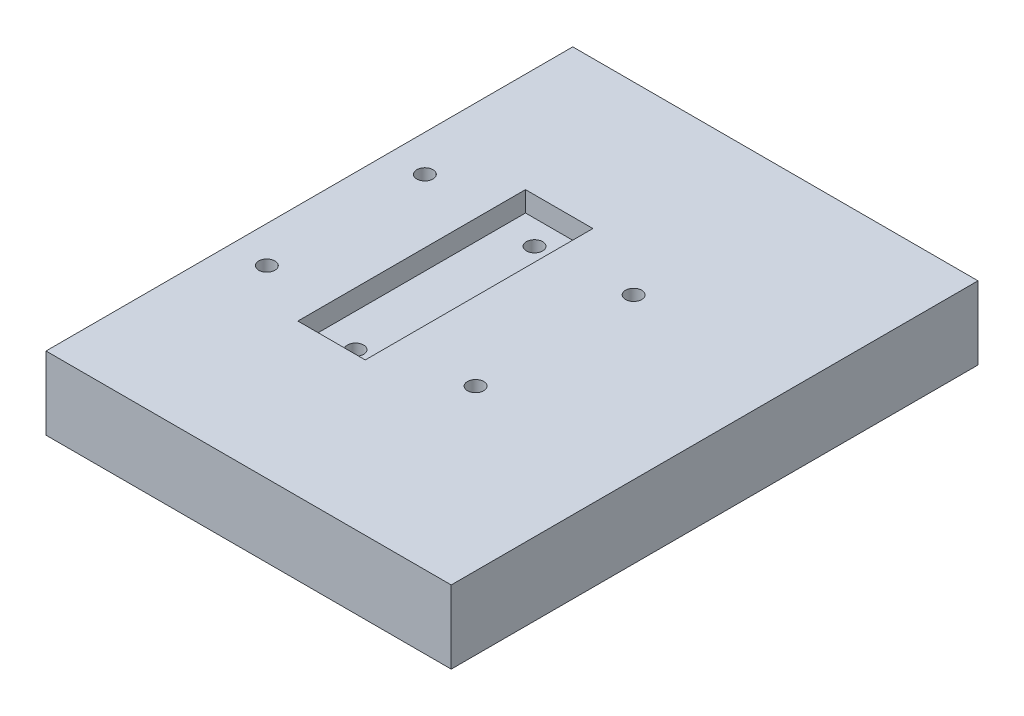
ISO-10303-21;
HEADER;
FILE_DESCRIPTION(('STEP AP214'),'2;1');
FILE_NAME('part.step','',(''),(''),'','','');
FILE_SCHEMA(('AUTOMOTIVE_DESIGN { 1 0 10303 214 1 1 1 1 }'));
ENDSEC;
DATA;
#1=APPLICATION_CONTEXT('core data for automotive mechanical design processes');
#2=APPLICATION_PROTOCOL_DEFINITION('international standard','automotive_design',2000,#1);
#3=PRODUCT_CONTEXT('',#1,'mechanical');
#4=PRODUCT('Part','Part','',(#3));
#5=PRODUCT_RELATED_PRODUCT_CATEGORY('part','',(#4));
#6=PRODUCT_DEFINITION_FORMATION('','',#4);
#7=PRODUCT_DEFINITION_CONTEXT('part definition',#1,'design');
#8=PRODUCT_DEFINITION('design','',#6,#7);
#9=PRODUCT_DEFINITION_SHAPE('','',#8);
#10=(LENGTH_UNIT() NAMED_UNIT(*) SI_UNIT(.MILLI.,.METRE.));
#11=(NAMED_UNIT(*) PLANE_ANGLE_UNIT() SI_UNIT($,.RADIAN.));
#12=(NAMED_UNIT(*) SI_UNIT($,.STERADIAN.) SOLID_ANGLE_UNIT());
#13=UNCERTAINTY_MEASURE_WITH_UNIT(LENGTH_MEASURE(1.E-05),#10,'distance_accuracy_value','');
#14=(GEOMETRIC_REPRESENTATION_CONTEXT(3) GLOBAL_UNCERTAINTY_ASSIGNED_CONTEXT((#13)) GLOBAL_UNIT_ASSIGNED_CONTEXT((#10,
#11,#12)) REPRESENTATION_CONTEXT('',''));
#15=CARTESIAN_POINT('',(0.,0.,0.));
#16=DIRECTION('',(0.,0.,1.));
#17=DIRECTION('',(1.,0.,0.));
#18=AXIS2_PLACEMENT_3D('',#15,#16,#17);
#19=CARTESIAN_POINT('',(-116.573423843831,0.,93.3786848568105));
#20=DIRECTION('',(0.,1.,0.));
#21=DIRECTION('',(0.,0.,1.));
#22=AXIS2_PLACEMENT_3D('',#19,#20,#21);
#23=CYLINDRICAL_SURFACE('',#22,1.99999999999774);
#24=CARTESIAN_POINT('',(-116.573423843831,0.,93.3786848568105));
#25=DIRECTION('',(0.,1.,0.));
#26=DIRECTION('',(0.,0.,1.));
#27=AXIS2_PLACEMENT_3D('',#24,#25,#26);
#28=CIRCLE('',#27,1.99999999999774);
#29=CARTESIAN_POINT('',(-116.573423843831,0.,95.3786848568083));
#30=VERTEX_POINT('',#29);
#31=EDGE_CURVE('E184',#30,#30,#28,.T.);
#32=ORIENTED_EDGE('',*,*,#31,.F.);
#33=EDGE_LOOP('',(#32));
#34=FACE_BOUND('',#33,.T.);
#35=CARTESIAN_POINT('',(-116.573423843831,13.,93.3786848568105));
#36=DIRECTION('',(0.,1.,0.));
#37=DIRECTION('',(0.,0.,1.));
#38=AXIS2_PLACEMENT_3D('',#35,#36,#37);
#39=CIRCLE('',#38,1.99999999999774);
#40=CARTESIAN_POINT('',(-116.573423843831,13.,95.3786848568083));
#41=VERTEX_POINT('',#40);
#42=EDGE_CURVE('E48',#41,#41,#39,.F.);
#43=ORIENTED_EDGE('',*,*,#42,.F.);
#44=EDGE_LOOP('',(#43));
#45=FACE_BOUND('',#44,.T.);
#46=ADVANCED_FACE('F44',(#34,#45),#23,.F.);
#47=CARTESIAN_POINT('',(-149.482451284049,18.,6.8579915728777));
#48=DIRECTION('',(1.,0.,0.));
#49=DIRECTION('',(0.,0.,-1.));
#50=AXIS2_PLACEMENT_3D('',#47,#48,#49);
#51=PLANE('',#50);
#52=DIRECTION('',(0.,0.,1.));
#53=VECTOR('',#52,1.);
#54=CARTESIAN_POINT('',(-149.482451284049,0.,6.8579915728777));
#55=LINE('',#54,#53);
#56=CARTESIAN_POINT('',(-149.482451284049,0.,6.8579915728777));
#57=VERTEX_POINT('',#56);
#58=CARTESIAN_POINT('',(-149.482451284049,0.,136.857991572878));
#59=VERTEX_POINT('',#58);
#60=EDGE_CURVE('E189',#57,#59,#55,.T.);
#61=ORIENTED_EDGE('',*,*,#60,.T.);
#62=DIRECTION('',(0.,-1.,0.));
#63=VECTOR('',#62,1.);
#64=CARTESIAN_POINT('',(-149.482451284049,18.,136.857991572878));
#65=LINE('',#64,#63);
#66=CARTESIAN_POINT('',(-149.482451284049,18.,136.857991572878));
#67=VERTEX_POINT('',#66);
#68=EDGE_CURVE('E13',#67,#59,#65,.T.);
#69=ORIENTED_EDGE('',*,*,#68,.F.);
#70=DIRECTION('',(0.,0.,1.));
#71=VECTOR('',#70,1.);
#72=CARTESIAN_POINT('',(-149.482451284049,18.,6.8579915728777));
#73=LINE('',#72,#71);
#74=CARTESIAN_POINT('',(-149.482451284049,18.,6.8579915728777));
#75=VERTEX_POINT('',#74);
#76=EDGE_CURVE('E190',#75,#67,#73,.T.);
#77=ORIENTED_EDGE('',*,*,#76,.F.);
#78=DIRECTION('',(0.,-1.,0.));
#79=VECTOR('',#78,1.);
#80=CARTESIAN_POINT('',(-149.482451284049,18.,6.8579915728777));
#81=LINE('',#80,#79);
#82=EDGE_CURVE('E196',#75,#57,#81,.T.);
#83=ORIENTED_EDGE('',*,*,#82,.T.);
#84=EDGE_LOOP('',(#61,#69,#77,#83));
#85=FACE_BOUND('',#84,.T.);
#86=ADVANCED_FACE('F46',(#85),#51,.F.);
#87=CARTESIAN_POINT('',(-149.482451284049,18.,136.857991572878));
#88=DIRECTION('',(0.,0.,-1.));
#89=DIRECTION('',(-1.,0.,0.));
#90=AXIS2_PLACEMENT_3D('',#87,#88,#89);
#91=PLANE('',#90);
#92=DIRECTION('',(1.,0.,0.));
#93=VECTOR('',#92,1.);
#94=CARTESIAN_POINT('',(-149.482451284049,0.,136.857991572878));
#95=LINE('',#94,#93);
#96=CARTESIAN_POINT('',(-49.4824512840494,0.,136.857991572878));
#97=VERTEX_POINT('',#96);
#98=EDGE_CURVE('E199',#59,#97,#95,.T.);
#99=ORIENTED_EDGE('',*,*,#98,.T.);
#100=DIRECTION('',(0.,-1.,0.));
#101=VECTOR('',#100,1.);
#102=CARTESIAN_POINT('',(-49.4824512840494,18.,136.857991572878));
#103=LINE('',#102,#101);
#104=CARTESIAN_POINT('',(-49.4824512840494,18.,136.857991572878));
#105=VERTEX_POINT('',#104);
#106=EDGE_CURVE('E53',#105,#97,#103,.T.);
#107=ORIENTED_EDGE('',*,*,#106,.F.);
#108=DIRECTION('',(1.,0.,0.));
#109=VECTOR('',#108,1.);
#110=CARTESIAN_POINT('',(-149.482451284049,18.,136.857991572878));
#111=LINE('',#110,#109);
#112=EDGE_CURVE('E97',#67,#105,#111,.T.);
#113=ORIENTED_EDGE('',*,*,#112,.F.);
#114=ORIENTED_EDGE('',*,*,#68,.T.);
#115=EDGE_LOOP('',(#99,#107,#113,#114));
#116=FACE_BOUND('',#115,.T.);
#117=ADVANCED_FACE('F229',(#116),#91,.F.);
#118=CARTESIAN_POINT('',(-49.4824512840494,18.,6.8579915728777));
#119=DIRECTION('',(-1.,0.,0.));
#120=DIRECTION('',(0.,0.,1.));
#121=AXIS2_PLACEMENT_3D('',#118,#119,#120);
#122=PLANE('',#121);
#123=DIRECTION('',(0.,0.,-1.));
#124=VECTOR('',#123,1.);
#125=CARTESIAN_POINT('',(-49.4824512840494,0.,6.8579915728777));
#126=LINE('',#125,#124);
#127=CARTESIAN_POINT('',(-49.4824512840494,0.,6.8579915728777));
#128=VERTEX_POINT('',#127);
#129=EDGE_CURVE('E201',#97,#128,#126,.T.);
#130=ORIENTED_EDGE('',*,*,#129,.T.);
#131=DIRECTION('',(0.,-1.,0.));
#132=VECTOR('',#131,1.);
#133=CARTESIAN_POINT('',(-49.4824512840494,18.,6.8579915728777));
#134=LINE('',#133,#132);
#135=CARTESIAN_POINT('',(-49.4824512840494,18.,6.8579915728777));
#136=VERTEX_POINT('',#135);
#137=EDGE_CURVE('E205',#136,#128,#134,.T.);
#138=ORIENTED_EDGE('',*,*,#137,.F.);
#139=DIRECTION('',(0.,0.,-1.));
#140=VECTOR('',#139,1.);
#141=CARTESIAN_POINT('',(-49.4824512840494,18.,6.8579915728777));
#142=LINE('',#141,#140);
#143=EDGE_CURVE('E193',#105,#136,#142,.T.);
#144=ORIENTED_EDGE('',*,*,#143,.F.);
#145=ORIENTED_EDGE('',*,*,#106,.T.);
#146=EDGE_LOOP('',(#130,#138,#144,#145));
#147=FACE_BOUND('',#146,.T.);
#148=ADVANCED_FACE('F211',(#147),#122,.F.);
#149=CARTESIAN_POINT('',(-149.482451284049,18.,6.8579915728777));
#150=DIRECTION('',(0.,0.,1.));
#151=DIRECTION('',(1.,0.,0.));
#152=AXIS2_PLACEMENT_3D('',#149,#150,#151);
#153=PLANE('',#152);
#154=DIRECTION('',(-1.,0.,0.));
#155=VECTOR('',#154,1.);
#156=CARTESIAN_POINT('',(-149.482451284049,0.,6.8579915728777));
#157=LINE('',#156,#155);
#158=EDGE_CURVE('E90',#128,#57,#157,.T.);
#159=ORIENTED_EDGE('',*,*,#158,.T.);
#160=ORIENTED_EDGE('',*,*,#82,.F.);
#161=DIRECTION('',(-1.,0.,0.));
#162=VECTOR('',#161,1.);
#163=CARTESIAN_POINT('',(-149.482451284049,18.,6.8579915728777));
#164=LINE('',#163,#162);
#165=EDGE_CURVE('E69',#136,#75,#164,.T.);
#166=ORIENTED_EDGE('',*,*,#165,.F.);
#167=ORIENTED_EDGE('',*,*,#137,.T.);
#168=EDGE_LOOP('',(#159,#160,#166,#167));
#169=FACE_BOUND('',#168,.T.);
#170=ADVANCED_FACE('F219',(#169),#153,.F.);
#171=CARTESIAN_POINT('',(0.,18.,0.));
#172=DIRECTION('',(0.,1.,0.));
#173=DIRECTION('',(0.,0.,1.));
#174=AXIS2_PLACEMENT_3D('',#171,#172,#173);
#175=PLANE('',#174);
#176=DIRECTION('',(0.,0.,-1.));
#177=VECTOR('',#176,1.);
#178=CARTESIAN_POINT('',(-108.171587330615,18.,99.3786848568105));
#179=LINE('',#178,#177);
#180=CARTESIAN_POINT('',(-108.171587330615,18.,99.3786848568105));
#181=VERTEX_POINT('',#180);
#182=CARTESIAN_POINT('',(-108.171587330615,18.,43.2028715778064));
#183=VERTEX_POINT('',#182);
#184=EDGE_CURVE('E60',#181,#183,#179,.T.);
#185=ORIENTED_EDGE('',*,*,#184,.F.);
#186=DIRECTION('',(1.,0.,0.));
#187=VECTOR('',#186,1.);
#188=CARTESIAN_POINT('',(-108.171587330615,18.,99.3786848568105));
#189=LINE('',#188,#187);
#190=CARTESIAN_POINT('',(-124.804001329811,18.,99.3786848568105));
#191=VERTEX_POINT('',#190);
#192=EDGE_CURVE('E140',#191,#181,#189,.T.);
#193=ORIENTED_EDGE('',*,*,#192,.F.);
#194=DIRECTION('',(0.,0.,1.));
#195=VECTOR('',#194,1.);
#196=CARTESIAN_POINT('',(-124.804001329811,18.,99.3786848568105));
#197=LINE('',#196,#195);
#198=CARTESIAN_POINT('',(-124.804001329811,18.,43.2028715778064));
#199=VERTEX_POINT('',#198);
#200=EDGE_CURVE('E143',#199,#191,#197,.T.);
#201=ORIENTED_EDGE('',*,*,#200,.F.);
#202=DIRECTION('',(-1.,0.,0.));
#203=VECTOR('',#202,1.);
#204=CARTESIAN_POINT('',(-108.171587330615,18.,43.2028715778064));
#205=LINE('',#204,#203);
#206=EDGE_CURVE('E152',#183,#199,#205,.T.);
#207=ORIENTED_EDGE('',*,*,#206,.F.);
#208=EDGE_LOOP('',(#185,#193,#201,#207));
#209=FACE_BOUND('',#208,.T.);
#210=CARTESIAN_POINT('',(-140.482451284049,18.,52.3579915728777));
#211=DIRECTION('',(0.,-1.,0.));
#212=DIRECTION('',(0.,0.,-1.));
#213=AXIS2_PLACEMENT_3D('',#210,#211,#212);
#214=CIRCLE('',#213,2.);
#215=CARTESIAN_POINT('',(-140.482451284049,18.,50.3579915728777));
#216=VERTEX_POINT('',#215);
#217=EDGE_CURVE('E162',#216,#216,#214,.T.);
#218=ORIENTED_EDGE('',*,*,#217,.T.);
#219=EDGE_LOOP('',(#218));
#220=FACE_BOUND('',#219,.T.);
#221=CARTESIAN_POINT('',(-140.482451284049,18.,91.3579915728777));
#222=DIRECTION('',(0.,-1.,0.));
#223=DIRECTION('',(0.,0.,-1.));
#224=AXIS2_PLACEMENT_3D('',#221,#222,#223);
#225=CIRCLE('',#224,2.);
#226=CARTESIAN_POINT('',(-140.482451284049,18.,89.3579915728777));
#227=VERTEX_POINT('',#226);
#228=EDGE_CURVE('E169',#227,#227,#225,.T.);
#229=ORIENTED_EDGE('',*,*,#228,.T.);
#230=EDGE_LOOP('',(#229));
#231=FACE_BOUND('',#230,.T.);
#232=CARTESIAN_POINT('',(-88.9663313244692,18.,91.3579915728777));
#233=DIRECTION('',(0.,-1.,0.));
#234=DIRECTION('',(0.,0.,-1.));
#235=AXIS2_PLACEMENT_3D('',#232,#233,#234);
#236=CIRCLE('',#235,2.);
#237=CARTESIAN_POINT('',(-88.9663313244692,18.,89.3579915728777));
#238=VERTEX_POINT('',#237);
#239=EDGE_CURVE('E175',#238,#238,#236,.T.);
#240=ORIENTED_EDGE('',*,*,#239,.T.);
#241=EDGE_LOOP('',(#240));
#242=FACE_BOUND('',#241,.T.);
#243=CARTESIAN_POINT('',(-88.9663313244692,18.,52.3579915728777));
#244=DIRECTION('',(0.,-1.,0.));
#245=DIRECTION('',(0.,0.,-1.));
#246=AXIS2_PLACEMENT_3D('',#243,#244,#245);
#247=CIRCLE('',#246,2.);
#248=CARTESIAN_POINT('',(-88.9663313244692,18.,50.3579915728777));
#249=VERTEX_POINT('',#248);
#250=EDGE_CURVE('E181',#249,#249,#247,.T.);
#251=ORIENTED_EDGE('',*,*,#250,.T.);
#252=EDGE_LOOP('',(#251));
#253=FACE_BOUND('',#252,.T.);
#254=ORIENTED_EDGE('',*,*,#76,.T.);
#255=ORIENTED_EDGE('',*,*,#112,.T.);
#256=ORIENTED_EDGE('',*,*,#143,.T.);
#257=ORIENTED_EDGE('',*,*,#165,.T.);
#258=EDGE_LOOP('',(#254,#255,#256,#257));
#259=FACE_BOUND('',#258,.T.);
#260=ADVANCED_FACE('F221',(#209,#220,#231,#242,#253,#259),#175,.T.);
#261=CARTESIAN_POINT('',(0.,0.,0.));
#262=DIRECTION('',(0.,1.,0.));
#263=DIRECTION('',(0.,0.,1.));
#264=AXIS2_PLACEMENT_3D('',#261,#262,#263);
#265=PLANE('',#264);
#266=CARTESIAN_POINT('',(-140.482451284049,0.,52.3579915728777));
#267=DIRECTION('',(0.,-1.,0.));
#268=DIRECTION('',(0.,0.,-1.));
#269=AXIS2_PLACEMENT_3D('',#266,#267,#268);
#270=CIRCLE('',#269,2.);
#271=CARTESIAN_POINT('',(-140.482451284049,0.,50.3579915728777));
#272=VERTEX_POINT('',#271);
#273=EDGE_CURVE('E166',#272,#272,#270,.T.);
#274=ORIENTED_EDGE('',*,*,#273,.F.);
#275=EDGE_LOOP('',(#274));
#276=FACE_BOUND('',#275,.T.);
#277=CARTESIAN_POINT('',(-140.482451284049,0.,91.3579915728777));
#278=DIRECTION('',(0.,-1.,0.));
#279=DIRECTION('',(0.,0.,-1.));
#280=AXIS2_PLACEMENT_3D('',#277,#278,#279);
#281=CIRCLE('',#280,2.);
#282=CARTESIAN_POINT('',(-140.482451284049,0.,89.3579915728777));
#283=VERTEX_POINT('',#282);
#284=EDGE_CURVE('E165',#283,#283,#281,.T.);
#285=ORIENTED_EDGE('',*,*,#284,.F.);
#286=EDGE_LOOP('',(#285));
#287=FACE_BOUND('',#286,.T.);
#288=CARTESIAN_POINT('',(-88.9663313244692,0.,91.3579915728777));
#289=DIRECTION('',(0.,-1.,0.));
#290=DIRECTION('',(0.,0.,-1.));
#291=AXIS2_PLACEMENT_3D('',#288,#289,#290);
#292=CIRCLE('',#291,2.);
#293=CARTESIAN_POINT('',(-88.9663313244692,0.,89.3579915728777));
#294=VERTEX_POINT('',#293);
#295=EDGE_CURVE('E172',#294,#294,#292,.T.);
#296=ORIENTED_EDGE('',*,*,#295,.F.);
#297=EDGE_LOOP('',(#296));
#298=FACE_BOUND('',#297,.T.);
#299=CARTESIAN_POINT('',(-88.9663313244692,0.,52.3579915728777));
#300=DIRECTION('',(0.,-1.,0.));
#301=DIRECTION('',(0.,0.,-1.));
#302=AXIS2_PLACEMENT_3D('',#299,#300,#301);
#303=CIRCLE('',#302,2.);
#304=CARTESIAN_POINT('',(-88.9663313244692,0.,50.3579915728777));
#305=VERTEX_POINT('',#304);
#306=EDGE_CURVE('E178',#305,#305,#303,.T.);
#307=ORIENTED_EDGE('',*,*,#306,.F.);
#308=EDGE_LOOP('',(#307));
#309=FACE_BOUND('',#308,.T.);
#310=ORIENTED_EDGE('',*,*,#31,.T.);
#311=EDGE_LOOP('',(#310));
#312=FACE_BOUND('',#311,.T.);
#313=ORIENTED_EDGE('',*,*,#60,.F.);
#314=ORIENTED_EDGE('',*,*,#158,.F.);
#315=ORIENTED_EDGE('',*,*,#129,.F.);
#316=ORIENTED_EDGE('',*,*,#98,.F.);
#317=EDGE_LOOP('',(#313,#314,#315,#316));
#318=FACE_BOUND('',#317,.T.);
#319=ADVANCED_FACE('F215',(#276,#287,#298,#309,#312,#318),#265,.F.);
#320=CARTESIAN_POINT('',(-88.9663313244692,18.,52.3579915728777));
#321=DIRECTION('',(0.,-1.,0.));
#322=DIRECTION('',(0.,0.,-1.));
#323=AXIS2_PLACEMENT_3D('',#320,#321,#322);
#324=CYLINDRICAL_SURFACE('',#323,2.);
#325=ORIENTED_EDGE('',*,*,#250,.F.);
#326=EDGE_LOOP('',(#325));
#327=FACE_BOUND('',#326,.T.);
#328=ORIENTED_EDGE('',*,*,#306,.T.);
#329=EDGE_LOOP('',(#328));
#330=FACE_BOUND('',#329,.T.);
#331=ADVANCED_FACE('F241',(#327,#330),#324,.F.);
#332=CARTESIAN_POINT('',(-88.9663313244692,18.,91.3579915728777));
#333=DIRECTION('',(0.,-1.,0.));
#334=DIRECTION('',(0.,0.,-1.));
#335=AXIS2_PLACEMENT_3D('',#332,#333,#334);
#336=CYLINDRICAL_SURFACE('',#335,2.);
#337=ORIENTED_EDGE('',*,*,#239,.F.);
#338=EDGE_LOOP('',(#337));
#339=FACE_BOUND('',#338,.T.);
#340=ORIENTED_EDGE('',*,*,#295,.T.);
#341=EDGE_LOOP('',(#340));
#342=FACE_BOUND('',#341,.T.);
#343=ADVANCED_FACE('F248',(#339,#342),#336,.F.);
#344=CARTESIAN_POINT('',(-140.482451284049,18.,91.3579915728777));
#345=DIRECTION('',(0.,-1.,0.));
#346=DIRECTION('',(0.,0.,-1.));
#347=AXIS2_PLACEMENT_3D('',#344,#345,#346);
#348=CYLINDRICAL_SURFACE('',#347,2.);
#349=ORIENTED_EDGE('',*,*,#228,.F.);
#350=EDGE_LOOP('',(#349));
#351=FACE_BOUND('',#350,.T.);
#352=ORIENTED_EDGE('',*,*,#284,.T.);
#353=EDGE_LOOP('',(#352));
#354=FACE_BOUND('',#353,.T.);
#355=ADVANCED_FACE('F261',(#351,#354),#348,.F.);
#356=CARTESIAN_POINT('',(-140.482451284049,18.,52.3579915728777));
#357=DIRECTION('',(0.,-1.,0.));
#358=DIRECTION('',(0.,0.,-1.));
#359=AXIS2_PLACEMENT_3D('',#356,#357,#358);
#360=CYLINDRICAL_SURFACE('',#359,2.);
#361=ORIENTED_EDGE('',*,*,#217,.F.);
#362=EDGE_LOOP('',(#361));
#363=FACE_BOUND('',#362,.T.);
#364=ORIENTED_EDGE('',*,*,#273,.T.);
#365=EDGE_LOOP('',(#364));
#366=FACE_BOUND('',#365,.T.);
#367=ADVANCED_FACE('F266',(#363,#366),#360,.F.);
#368=CARTESIAN_POINT('',(0.,13.,0.));
#369=DIRECTION('',(0.,1.,0.));
#370=DIRECTION('',(0.,0.,1.));
#371=AXIS2_PLACEMENT_3D('',#368,#369,#370);
#372=PLANE('',#371);
#373=CARTESIAN_POINT('',(-116.573423843827,13.,49.2028715778064));
#374=DIRECTION('',(0.,1.,0.));
#375=DIRECTION('',(0.,0.,1.));
#376=AXIS2_PLACEMENT_3D('',#373,#374,#375);
#377=CIRCLE('',#376,2.00000000000091);
#378=CARTESIAN_POINT('',(-116.573423843827,13.,51.2028715778073));
#379=VERTEX_POINT('',#378);
#380=EDGE_CURVE('E146',#379,#379,#377,.T.);
#381=ORIENTED_EDGE('',*,*,#380,.F.);
#382=EDGE_LOOP('',(#381));
#383=FACE_BOUND('',#382,.T.);
#384=DIRECTION('',(0.,0.,-1.));
#385=VECTOR('',#384,1.);
#386=CARTESIAN_POINT('',(-108.171587330615,13.,99.3786848568105));
#387=LINE('',#386,#385);
#388=CARTESIAN_POINT('',(-108.171587330615,13.,99.3786848568105));
#389=VERTEX_POINT('',#388);
#390=CARTESIAN_POINT('',(-108.171587330615,13.,43.2028715778064));
#391=VERTEX_POINT('',#390);
#392=EDGE_CURVE('E121',#389,#391,#387,.T.);
#393=ORIENTED_EDGE('',*,*,#392,.T.);
#394=DIRECTION('',(-1.,0.,0.));
#395=VECTOR('',#394,1.);
#396=CARTESIAN_POINT('',(-108.171587330615,13.,43.2028715778064));
#397=LINE('',#396,#395);
#398=CARTESIAN_POINT('',(-124.804001329811,13.,43.2028715778064));
#399=VERTEX_POINT('',#398);
#400=EDGE_CURVE('E130',#391,#399,#397,.T.);
#401=ORIENTED_EDGE('',*,*,#400,.T.);
#402=DIRECTION('',(0.,0.,1.));
#403=VECTOR('',#402,1.);
#404=CARTESIAN_POINT('',(-124.804001329811,13.,99.3786848568105));
#405=LINE('',#404,#403);
#406=CARTESIAN_POINT('',(-124.804001329811,13.,99.3786848568105));
#407=VERTEX_POINT('',#406);
#408=EDGE_CURVE('E135',#399,#407,#405,.T.);
#409=ORIENTED_EDGE('',*,*,#408,.T.);
#410=DIRECTION('',(1.,0.,0.));
#411=VECTOR('',#410,1.);
#412=CARTESIAN_POINT('',(-108.171587330615,13.,99.3786848568105));
#413=LINE('',#412,#411);
#414=EDGE_CURVE('E127',#407,#389,#413,.T.);
#415=ORIENTED_EDGE('',*,*,#414,.T.);
#416=EDGE_LOOP('',(#393,#401,#409,#415));
#417=FACE_BOUND('',#416,.T.);
#418=ORIENTED_EDGE('',*,*,#42,.T.);
#419=EDGE_LOOP('',(#418));
#420=FACE_BOUND('',#419,.T.);
#421=ADVANCED_FACE('F137',(#383,#417,#420),#372,.T.);
#422=CARTESIAN_POINT('',(-108.171587330615,13.,99.3786848568105));
#423=DIRECTION('',(1.,0.,0.));
#424=DIRECTION('',(0.,0.,-1.));
#425=AXIS2_PLACEMENT_3D('',#422,#423,#424);
#426=PLANE('',#425);
#427=ORIENTED_EDGE('',*,*,#184,.T.);
#428=DIRECTION('',(0.,1.,0.));
#429=VECTOR('',#428,1.);
#430=CARTESIAN_POINT('',(-108.171587330615,13.,43.2028715778064));
#431=LINE('',#430,#429);
#432=EDGE_CURVE('E117',#391,#183,#431,.T.);
#433=ORIENTED_EDGE('',*,*,#432,.F.);
#434=ORIENTED_EDGE('',*,*,#392,.F.);
#435=DIRECTION('',(0.,1.,0.));
#436=VECTOR('',#435,1.);
#437=CARTESIAN_POINT('',(-108.171587330615,13.,99.3786848568105));
#438=LINE('',#437,#436);
#439=EDGE_CURVE('E157',#389,#181,#438,.T.);
#440=ORIENTED_EDGE('',*,*,#439,.T.);
#441=EDGE_LOOP('',(#427,#433,#434,#440));
#442=FACE_BOUND('',#441,.T.);
#443=ADVANCED_FACE('F119',(#442),#426,.F.);
#444=CARTESIAN_POINT('',(-108.171587330615,13.,99.3786848568105));
#445=DIRECTION('',(0.,0.,1.));
#446=DIRECTION('',(1.,0.,0.));
#447=AXIS2_PLACEMENT_3D('',#444,#445,#446);
#448=PLANE('',#447);
#449=ORIENTED_EDGE('',*,*,#192,.T.);
#450=ORIENTED_EDGE('',*,*,#439,.F.);
#451=ORIENTED_EDGE('',*,*,#414,.F.);
#452=DIRECTION('',(0.,1.,0.));
#453=VECTOR('',#452,1.);
#454=CARTESIAN_POINT('',(-124.804001329811,13.,99.3786848568105));
#455=LINE('',#454,#453);
#456=EDGE_CURVE('E159',#407,#191,#455,.T.);
#457=ORIENTED_EDGE('',*,*,#456,.T.);
#458=EDGE_LOOP('',(#449,#450,#451,#457));
#459=FACE_BOUND('',#458,.T.);
#460=ADVANCED_FACE('F276',(#459),#448,.F.);
#461=CARTESIAN_POINT('',(-124.804001329811,13.,99.3786848568105));
#462=DIRECTION('',(-1.,0.,0.));
#463=DIRECTION('',(0.,0.,1.));
#464=AXIS2_PLACEMENT_3D('',#461,#462,#463);
#465=PLANE('',#464);
#466=ORIENTED_EDGE('',*,*,#200,.T.);
#467=ORIENTED_EDGE('',*,*,#456,.F.);
#468=ORIENTED_EDGE('',*,*,#408,.F.);
#469=DIRECTION('',(0.,1.,0.));
#470=VECTOR('',#469,1.);
#471=CARTESIAN_POINT('',(-124.804001329811,13.,43.2028715778064));
#472=LINE('',#471,#470);
#473=EDGE_CURVE('E126',#399,#199,#472,.T.);
#474=ORIENTED_EDGE('',*,*,#473,.T.);
#475=EDGE_LOOP('',(#466,#467,#468,#474));
#476=FACE_BOUND('',#475,.T.);
#477=ADVANCED_FACE('F280',(#476),#465,.F.);
#478=CARTESIAN_POINT('',(-108.171587330615,13.,43.2028715778064));
#479=DIRECTION('',(0.,0.,-1.));
#480=DIRECTION('',(-1.,0.,0.));
#481=AXIS2_PLACEMENT_3D('',#478,#479,#480);
#482=PLANE('',#481);
#483=ORIENTED_EDGE('',*,*,#206,.T.);
#484=ORIENTED_EDGE('',*,*,#473,.F.);
#485=ORIENTED_EDGE('',*,*,#400,.F.);
#486=ORIENTED_EDGE('',*,*,#432,.T.);
#487=EDGE_LOOP('',(#483,#484,#485,#486));
#488=FACE_BOUND('',#487,.T.);
#489=ADVANCED_FACE('F131',(#488),#482,.F.);
#490=CARTESIAN_POINT('',(-116.573423843827,10.,49.2028715778064));
#491=DIRECTION('',(0.,1.,0.));
#492=DIRECTION('',(0.,0.,1.));
#493=AXIS2_PLACEMENT_3D('',#490,#491,#492);
#494=CYLINDRICAL_SURFACE('',#493,2.00000000000091);
#495=CARTESIAN_POINT('',(-116.573423843827,10.,49.2028715778064));
#496=DIRECTION('',(0.,1.,0.));
#497=DIRECTION('',(0.,0.,1.));
#498=AXIS2_PLACEMENT_3D('',#495,#496,#497);
#499=CIRCLE('',#498,2.00000000000091);
#500=CARTESIAN_POINT('',(-116.573423843827,10.,51.2028715778073));
#501=VERTEX_POINT('',#500);
#502=EDGE_CURVE('E153',#501,#501,#499,.T.);
#503=ORIENTED_EDGE('',*,*,#502,.F.);
#504=EDGE_LOOP('',(#503));
#505=FACE_BOUND('',#504,.T.);
#506=ORIENTED_EDGE('',*,*,#380,.T.);
#507=EDGE_LOOP('',(#506));
#508=FACE_BOUND('',#507,.T.);
#509=ADVANCED_FACE('F279',(#505,#508),#494,.F.);
#510=CARTESIAN_POINT('',(-116.573423843827,10.,49.2028715778064));
#511=DIRECTION('',(0.,1.,0.));
#512=DIRECTION('',(0.,0.,1.));
#513=AXIS2_PLACEMENT_3D('',#510,#511,#512);
#514=PLANE('',#513);
#515=ORIENTED_EDGE('',*,*,#502,.T.);
#516=EDGE_LOOP('',(#515));
#517=FACE_BOUND('',#516,.T.);
#518=ADVANCED_FACE('F292',(#517),#514,.T.);
#519=CLOSED_SHELL('',(#46,#86,#117,#148,#170,#260,#319,#331,#343,#355,#367,#421,#443,#460,#477,
#489,#509,#518));
#520=MANIFOLD_SOLID_BREP('B2',#519);
#521=ADVANCED_BREP_SHAPE_REPRESENTATION('',(#18,#520),#14);
#522=SHAPE_DEFINITION_REPRESENTATION(#9,#521);
ENDSEC;
END-ISO-10303-21;
